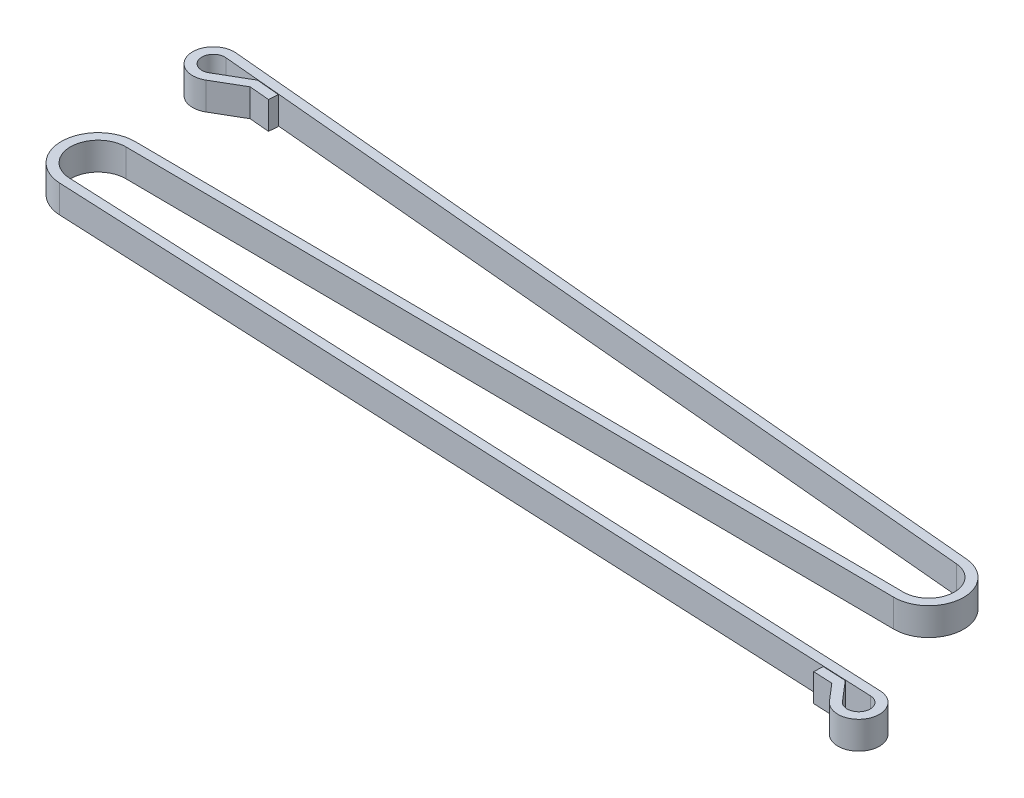
ISO-10303-21;
HEADER;
FILE_DESCRIPTION(('STEP AP214'),'2;1');
FILE_NAME('part.step','',(''),(''),'','','');
FILE_SCHEMA(('AUTOMOTIVE_DESIGN { 1 0 10303 214 1 1 1 1 }'));
ENDSEC;
DATA;
#1=APPLICATION_CONTEXT('core data for automotive mechanical design processes');
#2=APPLICATION_PROTOCOL_DEFINITION('international standard','automotive_design',2000,#1);
#3=PRODUCT_CONTEXT('',#1,'mechanical');
#4=PRODUCT('Part','Part','',(#3));
#5=PRODUCT_RELATED_PRODUCT_CATEGORY('part','',(#4));
#6=PRODUCT_DEFINITION_FORMATION('','',#4);
#7=PRODUCT_DEFINITION_CONTEXT('part definition',#1,'design');
#8=PRODUCT_DEFINITION('design','',#6,#7);
#9=PRODUCT_DEFINITION_SHAPE('','',#8);
#10=(LENGTH_UNIT() NAMED_UNIT(*) SI_UNIT(.MILLI.,.METRE.));
#11=(NAMED_UNIT(*) PLANE_ANGLE_UNIT() SI_UNIT($,.RADIAN.));
#12=(NAMED_UNIT(*) SI_UNIT($,.STERADIAN.) SOLID_ANGLE_UNIT());
#13=UNCERTAINTY_MEASURE_WITH_UNIT(LENGTH_MEASURE(1.E-05),#10,'distance_accuracy_value','');
#14=(GEOMETRIC_REPRESENTATION_CONTEXT(3) GLOBAL_UNCERTAINTY_ASSIGNED_CONTEXT((#13)) GLOBAL_UNIT_ASSIGNED_CONTEXT((#10,
#11,#12)) REPRESENTATION_CONTEXT('',''));
#15=CARTESIAN_POINT('',(0.,0.,0.));
#16=DIRECTION('',(0.,0.,1.));
#17=DIRECTION('',(1.,0.,0.));
#18=AXIS2_PLACEMENT_3D('',#15,#16,#17);
#19=CARTESIAN_POINT('',(-88.4029970114421,22.3267766952965,-24.7014694605002));
#20=DIRECTION('',(0.0905339533207894,0.,-0.99589336944078));
#21=DIRECTION('',(-0.99589336944078,0.,-0.0905339533207894));
#22=AXIS2_PLACEMENT_3D('',#19,#20,#21);
#23=PLANE('',#22);
#24=DIRECTION('',(0.99589336944078,0.,0.0905339533207894));
#25=VECTOR('',#24,1.);
#26=CARTESIAN_POINT('',(-88.4029970114421,16.3267766952965,-24.7014694605002));
#27=LINE('',#26,#25);
#28=CARTESIAN_POINT('',(-87.767727276281,16.3267766952965,-24.6437188194035));
#29=VERTEX_POINT('',#28);
#30=CARTESIAN_POINT('',(-83.4235301642382,16.3267766952965,-24.2487996938963));
#31=VERTEX_POINT('',#30);
#32=EDGE_CURVE('E228',#29,#31,#27,.T.);
#33=ORIENTED_EDGE('',*,*,#32,.T.);
#34=DIRECTION('',(0.,-1.,0.));
#35=VECTOR('',#34,1.);
#36=CARTESIAN_POINT('',(-83.4235301642382,22.3267766952965,-24.2487996938963));
#37=LINE('',#36,#35);
#38=CARTESIAN_POINT('',(-83.4235301642382,22.3267766952965,-24.2487996938963));
#39=VERTEX_POINT('',#38);
#40=EDGE_CURVE('E11',#39,#31,#37,.T.);
#41=ORIENTED_EDGE('',*,*,#40,.F.);
#42=DIRECTION('',(0.99589336944078,0.,0.0905339533207894));
#43=VECTOR('',#42,1.);
#44=CARTESIAN_POINT('',(-88.4029970114421,22.3267766952965,-24.7014694605002));
#45=LINE('',#44,#43);
#46=CARTESIAN_POINT('',(-87.767727276281,22.3267766952965,-24.6437188194035));
#47=VERTEX_POINT('',#46);
#48=EDGE_CURVE('E141',#47,#39,#45,.T.);
#49=ORIENTED_EDGE('',*,*,#48,.F.);
#50=DIRECTION('',(0.,-1.,0.));
#51=VECTOR('',#50,1.);
#52=CARTESIAN_POINT('',(-87.767727276281,22.3267766952965,-24.6437188194035));
#53=LINE('',#52,#51);
#54=EDGE_CURVE('E224',#47,#29,#53,.T.);
#55=ORIENTED_EDGE('',*,*,#54,.T.);
#56=EDGE_LOOP('',(#33,#41,#49,#55));
#57=FACE_BOUND('',#56,.T.);
#58=ADVANCED_FACE('F37',(#57),#23,.F.);
#59=CARTESIAN_POINT('',(-83.2424622575966,22.3267766952965,-26.2405864327778));
#60=DIRECTION('',(0.99589336944078,0.,0.0905339533207872));
#61=DIRECTION('',(0.0905339533207872,0.,-0.99589336944078));
#62=AXIS2_PLACEMENT_3D('',#59,#60,#61);
#63=PLANE('',#62);
#64=DIRECTION('',(-0.0905339533207872,0.,0.99589336944078));
#65=VECTOR('',#64,1.);
#66=CARTESIAN_POINT('',(-83.2424622575966,16.3267766952965,-26.2405864327778));
#67=LINE('',#66,#65);
#68=CARTESIAN_POINT('',(-83.2424622575966,16.3267766952965,-26.2405864327778));
#69=VERTEX_POINT('',#68);
#70=EDGE_CURVE('E231',#69,#31,#67,.T.);
#71=ORIENTED_EDGE('',*,*,#70,.F.);
#72=DIRECTION('',(0.,-1.,0.));
#73=VECTOR('',#72,1.);
#74=CARTESIAN_POINT('',(-83.2424622575966,22.3267766952965,-26.2405864327778));
#75=LINE('',#74,#73);
#76=CARTESIAN_POINT('',(-83.2424622575966,22.3267766952965,-26.2405864327778));
#77=VERTEX_POINT('',#76);
#78=EDGE_CURVE('E45',#77,#69,#75,.T.);
#79=ORIENTED_EDGE('',*,*,#78,.F.);
#80=DIRECTION('',(-0.0905339533207872,0.,0.99589336944078));
#81=VECTOR('',#80,1.);
#82=CARTESIAN_POINT('',(-83.2424622575966,22.3267766952965,-26.2405864327778));
#83=LINE('',#82,#81);
#84=EDGE_CURVE('E353',#77,#39,#83,.T.);
#85=ORIENTED_EDGE('',*,*,#84,.T.);
#86=ORIENTED_EDGE('',*,*,#40,.T.);
#87=EDGE_LOOP('',(#71,#79,#85,#86));
#88=FACE_BOUND('',#87,.T.);
#89=ADVANCED_FACE('F340',(#88),#63,.T.);
#90=CARTESIAN_POINT('',(-88.2219291048005,22.3267766952965,-26.6932561993818));
#91=DIRECTION('',(0.0905339533207894,0.,-0.99589336944078));
#92=DIRECTION('',(-0.99589336944078,0.,-0.0905339533207894));
#93=AXIS2_PLACEMENT_3D('',#90,#91,#92);
#94=PLANE('',#93);
#95=DIRECTION('',(0.99589336944078,0.,0.0905339533207894));
#96=VECTOR('',#95,1.);
#97=CARTESIAN_POINT('',(-88.2219291048005,16.3267766952965,-26.6932561993818));
#98=LINE('',#97,#96);
#99=CARTESIAN_POINT('',(-88.2219291048005,16.3267766952965,-26.6932561993818));
#100=VERTEX_POINT('',#99);
#101=EDGE_CURVE('E234',#100,#69,#98,.T.);
#102=ORIENTED_EDGE('',*,*,#101,.F.);
#103=DIRECTION('',(0.,-1.,0.));
#104=VECTOR('',#103,1.);
#105=CARTESIAN_POINT('',(-88.2219291048005,22.3267766952965,-26.6932561993818));
#106=LINE('',#105,#104);
#107=CARTESIAN_POINT('',(-88.2219291048005,22.3267766952965,-26.6932561993818));
#108=VERTEX_POINT('',#107);
#109=EDGE_CURVE('E330',#108,#100,#106,.T.);
#110=ORIENTED_EDGE('',*,*,#109,.F.);
#111=DIRECTION('',(0.99589336944078,0.,0.0905339533207894));
#112=VECTOR('',#111,1.);
#113=CARTESIAN_POINT('',(-88.2219291048005,22.3267766952965,-26.6932561993818));
#114=LINE('',#113,#112);
#115=EDGE_CURVE('E337',#108,#77,#114,.T.);
#116=ORIENTED_EDGE('',*,*,#115,.T.);
#117=ORIENTED_EDGE('',*,*,#78,.T.);
#118=EDGE_LOOP('',(#102,#110,#116,#117));
#119=FACE_BOUND('',#118,.T.);
#120=ADVANCED_FACE('F335',(#119),#94,.T.);
#121=CARTESIAN_POINT('',(-94.8481355476016,22.3267766952965,-22.8389900658078));
#122=DIRECTION('',(-0.50279794181319,0.,-0.864403973676903));
#123=DIRECTION('',(-0.864403973676903,0.,0.50279794181319));
#124=AXIS2_PLACEMENT_3D('',#121,#122,#123);
#125=PLANE('',#124);
#126=DIRECTION('',(0.864403973676903,0.,-0.50279794181319));
#127=VECTOR('',#126,1.);
#128=CARTESIAN_POINT('',(-94.8481355476016,16.3267766952965,-22.8389900658078));
#129=LINE('',#128,#127);
#130=CARTESIAN_POINT('',(-94.8481355476016,16.3267766952965,-22.8389900658078));
#131=VERTEX_POINT('',#130);
#132=EDGE_CURVE('E237',#131,#100,#129,.T.);
#133=ORIENTED_EDGE('',*,*,#132,.F.);
#134=DIRECTION('',(0.,-1.,0.));
#135=VECTOR('',#134,1.);
#136=CARTESIAN_POINT('',(-94.8481355476016,22.3267766952965,-22.8389900658078));
#137=LINE('',#136,#135);
#138=CARTESIAN_POINT('',(-94.8481355476016,22.3267766952965,-22.8389900658078));
#139=VERTEX_POINT('',#138);
#140=EDGE_CURVE('E328',#139,#131,#137,.T.);
#141=ORIENTED_EDGE('',*,*,#140,.F.);
#142=DIRECTION('',(0.864403973676903,0.,-0.50279794181319));
#143=VECTOR('',#142,1.);
#144=CARTESIAN_POINT('',(-94.8481355476016,22.3267766952965,-22.8389900658078));
#145=LINE('',#144,#143);
#146=EDGE_CURVE('E350',#139,#108,#145,.T.);
#147=ORIENTED_EDGE('',*,*,#146,.T.);
#148=ORIENTED_EDGE('',*,*,#109,.T.);
#149=EDGE_LOOP('',(#133,#141,#147,#148));
#150=FACE_BOUND('',#149,.T.);
#151=ADVANCED_FACE('F347',(#150),#125,.T.);
#152=CARTESIAN_POINT('',(-96.105130402128,22.3267766952965,-25.0000000000015));
#153=DIRECTION('',(0.,-1.,0.));
#154=DIRECTION('',(1.,0.,0.));
#155=AXIS2_PLACEMENT_3D('',#152,#153,#154);
#156=CYLINDRICAL_SURFACE('',#155,2.49999999999795);
#157=CARTESIAN_POINT('',(-96.105130402128,16.3267766952965,-25.0000000000015));
#158=DIRECTION('',(0.,1.,0.));
#159=DIRECTION('',(-1.,0.,0.));
#160=AXIS2_PLACEMENT_3D('',#157,#158,#159);
#161=CIRCLE('',#160,2.49999999999795);
#162=CARTESIAN_POINT('',(-95.8787955188262,16.3267766952965,-27.4897334236014));
#163=VERTEX_POINT('',#162);
#164=EDGE_CURVE('E240',#163,#131,#161,.T.);
#165=ORIENTED_EDGE('',*,*,#164,.F.);
#166=DIRECTION('',(0.,-1.,0.));
#167=VECTOR('',#166,1.);
#168=CARTESIAN_POINT('',(-95.8787955188262,22.3267766952965,-27.4897334236014));
#169=LINE('',#168,#167);
#170=CARTESIAN_POINT('',(-95.8787955188262,22.3267766952965,-27.4897334236014));
#171=VERTEX_POINT('',#170);
#172=EDGE_CURVE('E326',#171,#163,#169,.T.);
#173=ORIENTED_EDGE('',*,*,#172,.F.);
#174=CARTESIAN_POINT('',(-96.105130402128,22.3267766952965,-25.0000000000015));
#175=DIRECTION('',(0.,1.,0.));
#176=DIRECTION('',(-1.,0.,0.));
#177=AXIS2_PLACEMENT_3D('',#174,#175,#176);
#178=CIRCLE('',#177,2.49999999999795);
#179=EDGE_CURVE('E355',#171,#139,#178,.T.);
#180=ORIENTED_EDGE('',*,*,#179,.T.);
#181=ORIENTED_EDGE('',*,*,#140,.T.);
#182=EDGE_LOOP('',(#165,#173,#180,#181));
#183=FACE_BOUND('',#182,.T.);
#184=ADVANCED_FACE('F431',(#183),#156,.F.);
#185=CARTESIAN_POINT('',(78.5024634409296,22.3267766952966,-11.6372082003959));
#186=DIRECTION('',(-0.0905339533207897,0.,0.99589336944078));
#187=DIRECTION('',(0.99589336944078,0.,0.0905339533207897));
#188=AXIS2_PLACEMENT_3D('',#185,#186,#187);
#189=PLANE('',#188);
#190=DIRECTION('',(-0.99589336944078,0.,-0.0905339533207897));
#191=VECTOR('',#190,1.);
#192=CARTESIAN_POINT('',(78.5024634409296,16.3267766952966,-11.6372082003959));
#193=LINE('',#192,#191);
#194=CARTESIAN_POINT('',(78.5024634409296,16.3267766952966,-11.6372082003955));
#195=VERTEX_POINT('',#194);
#196=EDGE_CURVE('E243',#195,#163,#193,.T.);
#197=ORIENTED_EDGE('',*,*,#196,.F.);
#198=DIRECTION('',(0.,-1.,0.));
#199=VECTOR('',#198,1.);
#200=CARTESIAN_POINT('',(78.5024634409296,22.3267766952966,-11.6372082003955));
#201=LINE('',#200,#199);
#202=CARTESIAN_POINT('',(78.5024634409296,22.3267766952966,-11.6372082003955));
#203=VERTEX_POINT('',#202);
#204=EDGE_CURVE('E324',#203,#195,#201,.T.);
#205=ORIENTED_EDGE('',*,*,#204,.F.);
#206=DIRECTION('',(-0.99589336944078,0.,-0.0905339533207897));
#207=VECTOR('',#206,1.);
#208=CARTESIAN_POINT('',(78.5024634409296,22.3267766952966,-11.6372082003959));
#209=LINE('',#208,#207);
#210=EDGE_CURVE('E361',#203,#171,#209,.T.);
#211=ORIENTED_EDGE('',*,*,#210,.T.);
#212=ORIENTED_EDGE('',*,*,#172,.T.);
#213=EDGE_LOOP('',(#197,#205,#211,#212));
#214=FACE_BOUND('',#213,.T.);
#215=ADVANCED_FACE('F434',(#214),#189,.T.);
#216=CARTESIAN_POINT('',(77.9999999999997,22.3267766952966,-6.11000000000358));
#217=DIRECTION('',(0.,-1.,0.));
#218=DIRECTION('',(1.,0.,0.));
#219=AXIS2_PLACEMENT_3D('',#216,#217,#218);
#220=CYLINDRICAL_SURFACE('',#219,5.54999999999553);
#221=CARTESIAN_POINT('',(77.9999999999997,16.3267766952966,-6.11000000000358));
#222=DIRECTION('',(0.,1.,0.));
#223=DIRECTION('',(1.,0.,0.));
#224=AXIS2_PLACEMENT_3D('',#221,#222,#223);
#225=CIRCLE('',#224,5.54999999999553);
#226=CARTESIAN_POINT('',(77.956049841955,16.3267766952966,-0.560174022231533));
#227=VERTEX_POINT('',#226);
#228=EDGE_CURVE('E246',#227,#195,#225,.T.);
#229=ORIENTED_EDGE('',*,*,#228,.F.);
#230=DIRECTION('',(0.,-1.,0.));
#231=VECTOR('',#230,1.);
#232=CARTESIAN_POINT('',(77.956049841955,22.3267766952966,-0.560174022231529));
#233=LINE('',#232,#231);
#234=CARTESIAN_POINT('',(77.956049841955,22.3267766952966,-0.560174022231529));
#235=VERTEX_POINT('',#234);
#236=EDGE_CURVE('E322',#235,#227,#233,.T.);
#237=ORIENTED_EDGE('',*,*,#236,.F.);
#238=CARTESIAN_POINT('',(77.9999999999997,22.3267766952966,-6.11000000000358));
#239=DIRECTION('',(0.,1.,0.));
#240=DIRECTION('',(1.,0.,0.));
#241=AXIS2_PLACEMENT_3D('',#238,#239,#240);
#242=CIRCLE('',#241,5.54999999999553);
#243=EDGE_CURVE('E364',#235,#203,#242,.T.);
#244=ORIENTED_EDGE('',*,*,#243,.T.);
#245=ORIENTED_EDGE('',*,*,#204,.T.);
#246=EDGE_LOOP('',(#229,#237,#244,#245));
#247=FACE_BOUND('',#246,.T.);
#248=ADVANCED_FACE('F438',(#247),#220,.F.);
#249=CARTESIAN_POINT('',(77.956049841955,22.3267766952966,-0.560174022231529));
#250=DIRECTION('',(0.00791894739544018,0.,-0.999968644644495));
#251=DIRECTION('',(-0.999968644644495,0.,-0.00791894739544018));
#252=AXIS2_PLACEMENT_3D('',#249,#250,#251);
#253=PLANE('',#252);
#254=DIRECTION('',(0.999968644644495,0.,0.00791894739544018));
#255=VECTOR('',#254,1.);
#256=CARTESIAN_POINT('',(77.956049841955,16.3267766952966,-0.560174022231533));
#257=LINE('',#256,#255);
#258=CARTESIAN_POINT('',(-89.9366484208362,16.3267766952965,-1.8897491571541));
#259=VERTEX_POINT('',#258);
#260=EDGE_CURVE('E249',#259,#227,#257,.T.);
#261=ORIENTED_EDGE('',*,*,#260,.F.);
#262=DIRECTION('',(0.,-1.,0.));
#263=VECTOR('',#262,1.);
#264=CARTESIAN_POINT('',(-89.9366484208362,22.3267766952965,-1.88974915715409));
#265=LINE('',#264,#263);
#266=CARTESIAN_POINT('',(-89.9366484208362,22.3267766952965,-1.88974915715409));
#267=VERTEX_POINT('',#266);
#268=EDGE_CURVE('E320',#267,#259,#265,.T.);
#269=ORIENTED_EDGE('',*,*,#268,.F.);
#270=DIRECTION('',(0.999968644644495,0.,0.00791894739544018));
#271=VECTOR('',#270,1.);
#272=CARTESIAN_POINT('',(77.956049841955,22.3267766952966,-0.560174022231529));
#273=LINE('',#272,#271);
#274=EDGE_CURVE('E367',#267,#235,#273,.T.);
#275=ORIENTED_EDGE('',*,*,#274,.T.);
#276=ORIENTED_EDGE('',*,*,#236,.T.);
#277=EDGE_LOOP('',(#261,#269,#275,#276));
#278=FACE_BOUND('',#277,.T.);
#279=ADVANCED_FACE('F442',(#278),#253,.T.);
#280=CARTESIAN_POINT('',(-89.9999999999998,22.3267766952965,6.11000000000324));
#281=DIRECTION('',(0.,-1.,0.));
#282=DIRECTION('',(1.,0.,0.));
#283=AXIS2_PLACEMENT_3D('',#280,#281,#282);
#284=CYLINDRICAL_SURFACE('',#283,8.00000000000137);
#285=CARTESIAN_POINT('',(-89.9999999999998,16.3267766952965,6.11000000000323));
#286=DIRECTION('',(0.,-1.,0.));
#287=DIRECTION('',(-1.,0.,0.));
#288=AXIS2_PLACEMENT_3D('',#285,#286,#287);
#289=CIRCLE('',#288,8.00000000000137);
#290=CARTESIAN_POINT('',(-90.3641394185403,16.3267766952965,14.1017083582885));
#291=VERTEX_POINT('',#290);
#292=EDGE_CURVE('E252',#291,#259,#289,.T.);
#293=ORIENTED_EDGE('',*,*,#292,.F.);
#294=DIRECTION('',(0.,-1.,0.));
#295=VECTOR('',#294,1.);
#296=CARTESIAN_POINT('',(-90.3641394185403,22.3267766952965,14.1017083582885));
#297=LINE('',#296,#295);
#298=CARTESIAN_POINT('',(-90.3641394185403,22.3267766952965,14.1017083582885));
#299=VERTEX_POINT('',#298);
#300=EDGE_CURVE('E318',#299,#291,#297,.T.);
#301=ORIENTED_EDGE('',*,*,#300,.F.);
#302=CARTESIAN_POINT('',(-89.9999999999998,22.3267766952965,6.11000000000324));
#303=DIRECTION('',(0.,-1.,0.));
#304=DIRECTION('',(-1.,0.,0.));
#305=AXIS2_PLACEMENT_3D('',#302,#303,#304);
#306=CIRCLE('',#305,8.00000000000137);
#307=EDGE_CURVE('E370',#299,#267,#306,.T.);
#308=ORIENTED_EDGE('',*,*,#307,.T.);
#309=ORIENTED_EDGE('',*,*,#268,.T.);
#310=EDGE_LOOP('',(#293,#301,#308,#309));
#311=FACE_BOUND('',#310,.T.);
#312=ADVANCED_FACE('F446',(#311),#284,.T.);
#313=CARTESIAN_POINT('',(94.0086631661594,22.3267766952966,22.5025911380359));
#314=DIRECTION('',(-0.0455174273175596,0.,0.99896354478549));
#315=DIRECTION('',(0.99896354478549,0.,0.0455174273175596));
#316=AXIS2_PLACEMENT_3D('',#313,#314,#315);
#317=PLANE('',#316);
#318=DIRECTION('',(-0.99896354478549,0.,-0.0455174273175596));
#319=VECTOR('',#318,1.);
#320=CARTESIAN_POINT('',(94.0086631661594,16.3267766952966,22.5025911380359));
#321=LINE('',#320,#319);
#322=CARTESIAN_POINT('',(94.0086631661594,16.3267766952966,22.5025911380359));
#323=VERTEX_POINT('',#322);
#324=EDGE_CURVE('E255',#323,#291,#321,.T.);
#325=ORIENTED_EDGE('',*,*,#324,.F.);
#326=DIRECTION('',(0.,-1.,0.));
#327=VECTOR('',#326,1.);
#328=CARTESIAN_POINT('',(94.0086631661594,22.3267766952966,22.5025911380359));
#329=LINE('',#328,#327);
#330=CARTESIAN_POINT('',(94.0086631661594,22.3267766952966,22.5025911380359));
#331=VERTEX_POINT('',#330);
#332=EDGE_CURVE('E316',#331,#323,#329,.T.);
#333=ORIENTED_EDGE('',*,*,#332,.F.);
#334=DIRECTION('',(-0.99896354478549,0.,-0.0455174273175596));
#335=VECTOR('',#334,1.);
#336=CARTESIAN_POINT('',(94.0086631661594,22.3267766952966,22.5025911380359));
#337=LINE('',#336,#335);
#338=EDGE_CURVE('E373',#331,#299,#337,.T.);
#339=ORIENTED_EDGE('',*,*,#338,.T.);
#340=ORIENTED_EDGE('',*,*,#300,.T.);
#341=EDGE_LOOP('',(#325,#333,#339,#340));
#342=FACE_BOUND('',#341,.T.);
#343=ADVANCED_FACE('F450',(#342),#317,.T.);
#344=CARTESIAN_POINT('',(93.8948695978655,22.3267766952966,24.9999999999998));
#345=DIRECTION('',(0.,-1.,0.));
#346=DIRECTION('',(1.,0.,0.));
#347=AXIS2_PLACEMENT_3D('',#344,#345,#346);
#348=CYLINDRICAL_SURFACE('',#347,2.50000000000016);
#349=CARTESIAN_POINT('',(93.8948695978655,16.3267766952966,24.9999999999998));
#350=DIRECTION('',(0.,1.,0.));
#351=DIRECTION('',(1.,0.,0.));
#352=AXIS2_PLACEMENT_3D('',#349,#350,#351);
#353=CIRCLE('',#352,2.50000000000016);
#354=CARTESIAN_POINT('',(91.9972503243078,16.3267766952966,26.6275875069017));
#355=VERTEX_POINT('',#354);
#356=EDGE_CURVE('E258',#355,#323,#353,.T.);
#357=ORIENTED_EDGE('',*,*,#356,.F.);
#358=DIRECTION('',(0.,-1.,0.));
#359=VECTOR('',#358,1.);
#360=CARTESIAN_POINT('',(91.9972503243078,22.3267766952966,26.6275875069017));
#361=LINE('',#360,#359);
#362=CARTESIAN_POINT('',(91.9972503243078,22.3267766952966,26.6275875069017));
#363=VERTEX_POINT('',#362);
#364=EDGE_CURVE('E314',#363,#355,#361,.T.);
#365=ORIENTED_EDGE('',*,*,#364,.F.);
#366=CARTESIAN_POINT('',(93.8948695978655,22.3267766952966,24.9999999999998));
#367=DIRECTION('',(0.,1.,0.));
#368=DIRECTION('',(1.,0.,0.));
#369=AXIS2_PLACEMENT_3D('',#366,#367,#368);
#370=CIRCLE('',#369,2.50000000000016);
#371=EDGE_CURVE('E376',#363,#331,#370,.T.);
#372=ORIENTED_EDGE('',*,*,#371,.T.);
#373=ORIENTED_EDGE('',*,*,#332,.T.);
#374=EDGE_LOOP('',(#357,#365,#372,#373));
#375=FACE_BOUND('',#374,.T.);
#376=ADVANCED_FACE('F454',(#375),#348,.F.);
#377=CARTESIAN_POINT('',(91.9972503243078,22.3267766952966,26.6275875069017));
#378=DIRECTION('',(0.759047709423068,0.,-0.651035002760677));
#379=DIRECTION('',(-0.651035002760677,0.,-0.759047709423068));
#380=AXIS2_PLACEMENT_3D('',#377,#378,#379);
#381=PLANE('',#380);
#382=DIRECTION('',(0.651035002760677,0.,0.759047709423068));
#383=VECTOR('',#382,1.);
#384=CARTESIAN_POINT('',(91.9972503243078,16.3267766952966,26.6275875069017));
#385=LINE('',#384,#383);
#386=CARTESIAN_POINT('',(88.3228968428104,16.3267766952966,22.343624921304));
#387=VERTEX_POINT('',#386);
#388=EDGE_CURVE('E261',#387,#355,#385,.T.);
#389=ORIENTED_EDGE('',*,*,#388,.F.);
#390=DIRECTION('',(0.,-1.,0.));
#391=VECTOR('',#390,1.);
#392=CARTESIAN_POINT('',(88.3228968428104,22.3267766952966,22.343624921304));
#393=LINE('',#392,#391);
#394=CARTESIAN_POINT('',(88.3228968428104,22.3267766952966,22.343624921304));
#395=VERTEX_POINT('',#394);
#396=EDGE_CURVE('E312',#395,#387,#393,.T.);
#397=ORIENTED_EDGE('',*,*,#396,.F.);
#398=DIRECTION('',(0.651035002760677,0.,0.759047709423068));
#399=VECTOR('',#398,1.);
#400=CARTESIAN_POINT('',(91.9972503243078,22.3267766952966,26.6275875069017));
#401=LINE('',#400,#399);
#402=EDGE_CURVE('E379',#395,#363,#401,.T.);
#403=ORIENTED_EDGE('',*,*,#402,.T.);
#404=ORIENTED_EDGE('',*,*,#364,.T.);
#405=EDGE_LOOP('',(#389,#397,#403,#404));
#406=FACE_BOUND('',#405,.T.);
#407=ADVANCED_FACE('F458',(#406),#381,.T.);
#408=CARTESIAN_POINT('',(88.3228968428104,22.3267766952966,22.343624921304));
#409=DIRECTION('',(0.0455174273175589,0.,-0.99896354478549));
#410=DIRECTION('',(-0.99896354478549,0.,-0.0455174273175589));
#411=AXIS2_PLACEMENT_3D('',#408,#409,#410);
#412=PLANE('',#411);
#413=DIRECTION('',(0.99896354478549,0.,0.0455174273175589));
#414=VECTOR('',#413,1.);
#415=CARTESIAN_POINT('',(88.3228968428104,16.3267766952966,22.343624921304));
#416=LINE('',#415,#414);
#417=CARTESIAN_POINT('',(83.328079118883,16.3267766952966,22.1160377847162));
#418=VERTEX_POINT('',#417);
#419=EDGE_CURVE('E264',#418,#387,#416,.T.);
#420=ORIENTED_EDGE('',*,*,#419,.F.);
#421=DIRECTION('',(0.,-1.,0.));
#422=VECTOR('',#421,1.);
#423=CARTESIAN_POINT('',(83.328079118883,22.3267766952966,22.1160377847162));
#424=LINE('',#423,#422);
#425=CARTESIAN_POINT('',(83.328079118883,22.3267766952966,22.1160377847162));
#426=VERTEX_POINT('',#425);
#427=EDGE_CURVE('E310',#426,#418,#424,.T.);
#428=ORIENTED_EDGE('',*,*,#427,.F.);
#429=DIRECTION('',(0.99896354478549,0.,0.0455174273175589));
#430=VECTOR('',#429,1.);
#431=CARTESIAN_POINT('',(88.3228968428104,22.3267766952966,22.343624921304));
#432=LINE('',#431,#430);
#433=EDGE_CURVE('E382',#426,#395,#432,.T.);
#434=ORIENTED_EDGE('',*,*,#433,.T.);
#435=ORIENTED_EDGE('',*,*,#396,.T.);
#436=EDGE_LOOP('',(#420,#428,#434,#435));
#437=FACE_BOUND('',#436,.T.);
#438=ADVANCED_FACE('F462',(#437),#412,.T.);
#439=CARTESIAN_POINT('',(83.2370442642479,22.3267766952966,24.1139648742872));
#440=DIRECTION('',(-0.99896354478549,0.,-0.0455174273175582));
#441=DIRECTION('',(-0.0455174273175582,0.,0.99896354478549));
#442=AXIS2_PLACEMENT_3D('',#439,#440,#441);
#443=PLANE('',#442);
#444=DIRECTION('',(0.0455174273175582,0.,-0.99896354478549));
#445=VECTOR('',#444,1.);
#446=CARTESIAN_POINT('',(83.2370442642479,16.3267766952966,24.1139648742872));
#447=LINE('',#446,#445);
#448=CARTESIAN_POINT('',(83.2370442642479,16.3267766952966,24.1139648742872));
#449=VERTEX_POINT('',#448);
#450=EDGE_CURVE('E267',#449,#418,#447,.T.);
#451=ORIENTED_EDGE('',*,*,#450,.F.);
#452=DIRECTION('',(0.,-1.,0.));
#453=VECTOR('',#452,1.);
#454=CARTESIAN_POINT('',(83.2370442642479,22.3267766952966,24.1139648742872));
#455=LINE('',#454,#453);
#456=CARTESIAN_POINT('',(83.2370442642479,22.3267766952966,24.1139648742872));
#457=VERTEX_POINT('',#456);
#458=EDGE_CURVE('E308',#457,#449,#455,.T.);
#459=ORIENTED_EDGE('',*,*,#458,.F.);
#460=DIRECTION('',(0.0455174273175582,0.,-0.99896354478549));
#461=VECTOR('',#460,1.);
#462=CARTESIAN_POINT('',(83.2370442642479,22.3267766952966,24.1139648742872));
#463=LINE('',#462,#461);
#464=EDGE_CURVE('E385',#457,#426,#463,.T.);
#465=ORIENTED_EDGE('',*,*,#464,.T.);
#466=ORIENTED_EDGE('',*,*,#427,.T.);
#467=EDGE_LOOP('',(#451,#459,#465,#466));
#468=FACE_BOUND('',#467,.T.);
#469=ADVANCED_FACE('F466',(#468),#443,.T.);
#470=CARTESIAN_POINT('',(88.2318619881753,22.3267766952966,24.3415520108749));
#471=DIRECTION('',(0.0455174273175589,0.,-0.99896354478549));
#472=DIRECTION('',(-0.99896354478549,0.,-0.0455174273175589));
#473=AXIS2_PLACEMENT_3D('',#470,#471,#472);
#474=PLANE('',#473);
#475=DIRECTION('',(0.99896354478549,0.,0.0455174273175589));
#476=VECTOR('',#475,1.);
#477=CARTESIAN_POINT('',(88.2318619881753,16.3267766952966,24.3415520108749));
#478=LINE('',#477,#476);
#479=CARTESIAN_POINT('',(87.3678724519615,16.3267766952966,24.3021846274273));
#480=VERTEX_POINT('',#479);
#481=EDGE_CURVE('E270',#449,#480,#478,.T.);
#482=ORIENTED_EDGE('',*,*,#481,.T.);
#483=DIRECTION('',(0.,-1.,0.));
#484=VECTOR('',#483,1.);
#485=CARTESIAN_POINT('',(87.3678724519615,22.3267766952966,24.3021846274274));
#486=LINE('',#485,#484);
#487=CARTESIAN_POINT('',(87.3678724519615,22.3267766952966,24.3021846274274));
#488=VERTEX_POINT('',#487);
#489=EDGE_CURVE('E305',#488,#480,#486,.T.);
#490=ORIENTED_EDGE('',*,*,#489,.F.);
#491=DIRECTION('',(0.99896354478549,0.,0.0455174273175589));
#492=VECTOR('',#491,1.);
#493=CARTESIAN_POINT('',(88.2318619881753,22.3267766952966,24.3415520108749));
#494=LINE('',#493,#492);
#495=EDGE_CURVE('E388',#457,#488,#494,.T.);
#496=ORIENTED_EDGE('',*,*,#495,.F.);
#497=ORIENTED_EDGE('',*,*,#458,.T.);
#498=EDGE_LOOP('',(#482,#490,#496,#497));
#499=FACE_BOUND('',#498,.T.);
#500=ADVANCED_FACE('F470',(#499),#474,.F.);
#501=CARTESIAN_POINT('',(90.4791549054616,22.3267766952966,27.929657512423));
#502=DIRECTION('',(0.759047709423068,0.,-0.651035002760677));
#503=DIRECTION('',(-0.651035002760677,0.,-0.759047709423068));
#504=AXIS2_PLACEMENT_3D('',#501,#502,#503);
#505=PLANE('',#504);
#506=DIRECTION('',(0.651035002760677,0.,0.759047709423068));
#507=VECTOR('',#506,1.);
#508=CARTESIAN_POINT('',(90.4791549054616,16.3267766952966,27.929657512423));
#509=LINE('',#508,#507);
#510=CARTESIAN_POINT('',(90.4791549054617,16.3267766952966,27.9296575124231));
#511=VERTEX_POINT('',#510);
#512=EDGE_CURVE('E272',#480,#511,#509,.T.);
#513=ORIENTED_EDGE('',*,*,#512,.T.);
#514=DIRECTION('',(0.,-1.,0.));
#515=VECTOR('',#514,1.);
#516=CARTESIAN_POINT('',(90.4791549054617,22.3267766952966,27.9296575124231));
#517=LINE('',#516,#515);
#518=CARTESIAN_POINT('',(90.4791549054617,22.3267766952966,27.9296575124231));
#519=VERTEX_POINT('',#518);
#520=EDGE_CURVE('E302',#519,#511,#517,.T.);
#521=ORIENTED_EDGE('',*,*,#520,.F.);
#522=DIRECTION('',(0.651035002760677,0.,0.759047709423068));
#523=VECTOR('',#522,1.);
#524=CARTESIAN_POINT('',(90.4791549054616,22.3267766952966,27.929657512423));
#525=LINE('',#524,#523);
#526=EDGE_CURVE('E390',#488,#519,#525,.T.);
#527=ORIENTED_EDGE('',*,*,#526,.F.);
#528=ORIENTED_EDGE('',*,*,#489,.T.);
#529=EDGE_LOOP('',(#513,#521,#527,#528));
#530=FACE_BOUND('',#529,.T.);
#531=ADVANCED_FACE('F474',(#530),#505,.F.);
#532=CARTESIAN_POINT('',(93.8948695978655,22.3267766952966,24.9999999999998));
#533=DIRECTION('',(0.,-1.,0.));
#534=DIRECTION('',(1.,0.,0.));
#535=AXIS2_PLACEMENT_3D('',#532,#533,#534);
#536=CYLINDRICAL_SURFACE('',#535,4.50000000000016);
#537=CARTESIAN_POINT('',(93.8948695978655,16.3267766952966,24.9999999999998));
#538=DIRECTION('',(0.,1.,0.));
#539=DIRECTION('',(1.,0.,0.));
#540=AXIS2_PLACEMENT_3D('',#537,#538,#539);
#541=CIRCLE('',#540,4.50000000000016);
#542=CARTESIAN_POINT('',(94.0996980207945,16.3267766952966,20.5046640484649));
#543=VERTEX_POINT('',#542);
#544=EDGE_CURVE('E274',#511,#543,#541,.T.);
#545=ORIENTED_EDGE('',*,*,#544,.T.);
#546=DIRECTION('',(0.,-1.,0.));
#547=VECTOR('',#546,1.);
#548=CARTESIAN_POINT('',(94.0996980207945,22.3267766952966,20.5046640484649));
#549=LINE('',#548,#547);
#550=CARTESIAN_POINT('',(94.0996980207945,22.3267766952966,20.5046640484649));
#551=VERTEX_POINT('',#550);
#552=EDGE_CURVE('E299',#551,#543,#549,.T.);
#553=ORIENTED_EDGE('',*,*,#552,.F.);
#554=CARTESIAN_POINT('',(93.8948695978655,22.3267766952966,24.9999999999998));
#555=DIRECTION('',(0.,1.,0.));
#556=DIRECTION('',(1.,0.,0.));
#557=AXIS2_PLACEMENT_3D('',#554,#555,#556);
#558=CIRCLE('',#557,4.50000000000016);
#559=EDGE_CURVE('E392',#519,#551,#558,.T.);
#560=ORIENTED_EDGE('',*,*,#559,.F.);
#561=ORIENTED_EDGE('',*,*,#520,.T.);
#562=EDGE_LOOP('',(#545,#553,#560,#561));
#563=FACE_BOUND('',#562,.T.);
#564=ADVANCED_FACE('F478',(#563),#536,.T.);
#565=CARTESIAN_POINT('',(94.0996980207945,22.3267766952966,20.5046640484649));
#566=DIRECTION('',(-0.0455174273175596,0.,0.99896354478549));
#567=DIRECTION('',(0.99896354478549,0.,0.0455174273175596));
#568=AXIS2_PLACEMENT_3D('',#565,#566,#567);
#569=PLANE('',#568);
#570=DIRECTION('',(-0.99896354478549,0.,-0.0455174273175596));
#571=VECTOR('',#570,1.);
#572=CARTESIAN_POINT('',(94.0996980207945,16.3267766952966,20.5046640484649));
#573=LINE('',#572,#571);
#574=CARTESIAN_POINT('',(-90.2731045639052,16.3267766952965,12.1037812687175));
#575=VERTEX_POINT('',#574);
#576=EDGE_CURVE('E276',#543,#575,#573,.T.);
#577=ORIENTED_EDGE('',*,*,#576,.T.);
#578=DIRECTION('',(0.,-1.,0.));
#579=VECTOR('',#578,1.);
#580=CARTESIAN_POINT('',(-90.2731045639052,22.3267766952965,12.1037812687175));
#581=LINE('',#580,#579);
#582=CARTESIAN_POINT('',(-90.2731045639052,22.3267766952965,12.1037812687175));
#583=VERTEX_POINT('',#582);
#584=EDGE_CURVE('E296',#583,#575,#581,.T.);
#585=ORIENTED_EDGE('',*,*,#584,.F.);
#586=DIRECTION('',(-0.99896354478549,0.,-0.0455174273175596));
#587=VECTOR('',#586,1.);
#588=CARTESIAN_POINT('',(94.0996980207945,22.3267766952966,20.5046640484649));
#589=LINE('',#588,#587);
#590=EDGE_CURVE('E394',#551,#583,#589,.T.);
#591=ORIENTED_EDGE('',*,*,#590,.F.);
#592=ORIENTED_EDGE('',*,*,#552,.T.);
#593=EDGE_LOOP('',(#577,#585,#591,#592));
#594=FACE_BOUND('',#593,.T.);
#595=ADVANCED_FACE('F482',(#594),#569,.F.);
#596=CARTESIAN_POINT('',(-89.9999999999998,22.3267766952965,6.11000000000324));
#597=DIRECTION('',(0.,-1.,0.));
#598=DIRECTION('',(1.,0.,0.));
#599=AXIS2_PLACEMENT_3D('',#596,#597,#598);
#600=CYLINDRICAL_SURFACE('',#599,6.00000000000137);
#601=CARTESIAN_POINT('',(-89.9999999999998,16.3267766952965,6.11000000000323));
#602=DIRECTION('',(0.,1.,0.));
#603=DIRECTION('',(1.,0.,0.));
#604=AXIS2_PLACEMENT_3D('',#601,#602,#603);
#605=CIRCLE('',#604,6.00000000000137);
#606=CARTESIAN_POINT('',(-89.9524863156272,16.3267766952965,0.110188132134877));
#607=VERTEX_POINT('',#606);
#608=EDGE_CURVE('E278',#575,#607,#605,.F.);
#609=ORIENTED_EDGE('',*,*,#608,.T.);
#610=DIRECTION('',(0.,-1.,0.));
#611=VECTOR('',#610,1.);
#612=CARTESIAN_POINT('',(-89.9524863156272,22.3267766952965,0.11018813213488));
#613=LINE('',#612,#611);
#614=CARTESIAN_POINT('',(-89.9524863156272,22.3267766952965,0.11018813213488));
#615=VERTEX_POINT('',#614);
#616=EDGE_CURVE('E293',#615,#607,#613,.T.);
#617=ORIENTED_EDGE('',*,*,#616,.F.);
#618=CARTESIAN_POINT('',(-89.9999999999998,22.3267766952965,6.11000000000324));
#619=DIRECTION('',(0.,1.,0.));
#620=DIRECTION('',(1.,0.,0.));
#621=AXIS2_PLACEMENT_3D('',#618,#619,#620);
#622=CIRCLE('',#621,6.00000000000137);
#623=EDGE_CURVE('E396',#583,#615,#622,.F.);
#624=ORIENTED_EDGE('',*,*,#623,.F.);
#625=ORIENTED_EDGE('',*,*,#584,.T.);
#626=EDGE_LOOP('',(#609,#617,#624,#625));
#627=FACE_BOUND('',#626,.T.);
#628=ADVANCED_FACE('F486',(#627),#600,.F.);
#629=CARTESIAN_POINT('',(77.9402119471641,22.3267766952966,1.43976326705746));
#630=DIRECTION('',(0.00791894739544018,0.,-0.999968644644495));
#631=DIRECTION('',(-0.999968644644495,0.,-0.00791894739544018));
#632=AXIS2_PLACEMENT_3D('',#629,#630,#631);
#633=PLANE('',#632);
#634=DIRECTION('',(0.999968644644495,0.,0.00791894739544018));
#635=VECTOR('',#634,1.);
#636=CARTESIAN_POINT('',(77.9402119471641,16.3267766952966,1.43976326705746));
#637=LINE('',#636,#635);
#638=CARTESIAN_POINT('',(77.9402119471641,16.3267766952966,1.43976326705789));
#639=VERTEX_POINT('',#638);
#640=EDGE_CURVE('E280',#607,#639,#637,.T.);
#641=ORIENTED_EDGE('',*,*,#640,.T.);
#642=DIRECTION('',(0.,-1.,0.));
#643=VECTOR('',#642,1.);
#644=CARTESIAN_POINT('',(77.9402119471641,22.3267766952966,1.43976326705789));
#645=LINE('',#644,#643);
#646=CARTESIAN_POINT('',(77.9402119471641,22.3267766952966,1.43976326705789));
#647=VERTEX_POINT('',#646);
#648=EDGE_CURVE('E290',#647,#639,#645,.T.);
#649=ORIENTED_EDGE('',*,*,#648,.F.);
#650=DIRECTION('',(0.999968644644495,0.,0.00791894739544018));
#651=VECTOR('',#650,1.);
#652=CARTESIAN_POINT('',(77.9402119471641,22.3267766952966,1.43976326705746));
#653=LINE('',#652,#651);
#654=EDGE_CURVE('E398',#615,#647,#653,.T.);
#655=ORIENTED_EDGE('',*,*,#654,.F.);
#656=ORIENTED_EDGE('',*,*,#616,.T.);
#657=EDGE_LOOP('',(#641,#649,#655,#656));
#658=FACE_BOUND('',#657,.T.);
#659=ADVANCED_FACE('F404',(#658),#633,.F.);
#660=CARTESIAN_POINT('',(77.9999999999997,22.3267766952966,-6.11000000000358));
#661=DIRECTION('',(0.,-1.,0.));
#662=DIRECTION('',(1.,0.,0.));
#663=AXIS2_PLACEMENT_3D('',#660,#661,#662);
#664=CYLINDRICAL_SURFACE('',#663,7.54999999999553);
#665=CARTESIAN_POINT('',(77.9999999999997,16.3267766952966,-6.11000000000358));
#666=DIRECTION('',(0.,1.,0.));
#667=DIRECTION('',(1.,0.,0.));
#668=AXIS2_PLACEMENT_3D('',#665,#666,#667);
#669=CIRCLE('',#668,7.54999999999553);
#670=CARTESIAN_POINT('',(78.6835313475712,16.3267766952966,-13.6289949392775));
#671=VERTEX_POINT('',#670);
#672=EDGE_CURVE('E282',#639,#671,#669,.T.);
#673=ORIENTED_EDGE('',*,*,#672,.T.);
#674=DIRECTION('',(0.,-1.,0.));
#675=VECTOR('',#674,1.);
#676=CARTESIAN_POINT('',(78.6835313475712,22.3267766952966,-13.6289949392774));
#677=LINE('',#676,#675);
#678=CARTESIAN_POINT('',(78.6835313475712,22.3267766952966,-13.6289949392774));
#679=VERTEX_POINT('',#678);
#680=EDGE_CURVE('E219',#679,#671,#677,.T.);
#681=ORIENTED_EDGE('',*,*,#680,.F.);
#682=CARTESIAN_POINT('',(77.9999999999997,22.3267766952966,-6.11000000000358));
#683=DIRECTION('',(0.,1.,0.));
#684=DIRECTION('',(1.,0.,0.));
#685=AXIS2_PLACEMENT_3D('',#682,#683,#684);
#686=CIRCLE('',#685,7.54999999999553);
#687=EDGE_CURVE('E210',#647,#679,#686,.T.);
#688=ORIENTED_EDGE('',*,*,#687,.F.);
#689=ORIENTED_EDGE('',*,*,#648,.T.);
#690=EDGE_LOOP('',(#673,#681,#688,#689));
#691=FACE_BOUND('',#690,.T.);
#692=ADVANCED_FACE('F408',(#691),#664,.T.);
#693=CARTESIAN_POINT('',(78.6835313475712,22.3267766952966,-13.6289949392774));
#694=DIRECTION('',(-0.0905339533207897,0.,0.99589336944078));
#695=DIRECTION('',(0.99589336944078,0.,0.0905339533207897));
#696=AXIS2_PLACEMENT_3D('',#693,#694,#695);
#697=PLANE('',#696);
#698=DIRECTION('',(-0.99589336944078,0.,-0.0905339533207897));
#699=VECTOR('',#698,1.);
#700=CARTESIAN_POINT('',(78.6835313475712,16.3267766952966,-13.6289949392775));
#701=LINE('',#700,#699);
#702=CARTESIAN_POINT('',(-95.6977276121846,16.3267766952965,-29.481520162483));
#703=VERTEX_POINT('',#702);
#704=EDGE_CURVE('E218',#671,#703,#701,.T.);
#705=ORIENTED_EDGE('',*,*,#704,.T.);
#706=DIRECTION('',(0.,-1.,0.));
#707=VECTOR('',#706,1.);
#708=CARTESIAN_POINT('',(-95.6977276121846,22.3267766952965,-29.481520162483));
#709=LINE('',#708,#707);
#710=CARTESIAN_POINT('',(-95.6977276121846,22.3267766952965,-29.481520162483));
#711=VERTEX_POINT('',#710);
#712=EDGE_CURVE('E215',#711,#703,#709,.T.);
#713=ORIENTED_EDGE('',*,*,#712,.F.);
#714=DIRECTION('',(-0.99589336944078,0.,-0.0905339533207897));
#715=VECTOR('',#714,1.);
#716=CARTESIAN_POINT('',(78.6835313475712,22.3267766952966,-13.6289949392774));
#717=LINE('',#716,#715);
#718=EDGE_CURVE('E204',#679,#711,#717,.T.);
#719=ORIENTED_EDGE('',*,*,#718,.F.);
#720=ORIENTED_EDGE('',*,*,#680,.T.);
#721=EDGE_LOOP('',(#705,#713,#719,#720));
#722=FACE_BOUND('',#721,.T.);
#723=ADVANCED_FACE('F216',(#722),#697,.F.);
#724=CARTESIAN_POINT('',(-96.105130402128,22.3267766952965,-25.0000000000015));
#725=DIRECTION('',(0.,-1.,0.));
#726=DIRECTION('',(1.,0.,0.));
#727=AXIS2_PLACEMENT_3D('',#724,#725,#726);
#728=CYLINDRICAL_SURFACE('',#727,4.49999999999795);
#729=CARTESIAN_POINT('',(-96.105130402128,16.3267766952965,-25.0000000000015));
#730=DIRECTION('',(0.,1.,0.));
#731=DIRECTION('',(1.,0.,0.));
#732=AXIS2_PLACEMENT_3D('',#729,#730,#731);
#733=CIRCLE('',#732,4.49999999999795);
#734=CARTESIAN_POINT('',(-93.8425396639752,16.3267766952965,-21.110182118454));
#735=VERTEX_POINT('',#734);
#736=EDGE_CURVE('E129',#703,#735,#733,.T.);
#737=ORIENTED_EDGE('',*,*,#736,.T.);
#738=DIRECTION('',(0.,-1.,0.));
#739=VECTOR('',#738,1.);
#740=CARTESIAN_POINT('',(-93.8425396639752,22.3267766952965,-21.110182118454));
#741=LINE('',#740,#739);
#742=CARTESIAN_POINT('',(-93.8425396639752,22.3267766952965,-21.110182118454));
#743=VERTEX_POINT('',#742);
#744=EDGE_CURVE('E220',#743,#735,#741,.T.);
#745=ORIENTED_EDGE('',*,*,#744,.F.);
#746=CARTESIAN_POINT('',(-96.105130402128,22.3267766952965,-25.0000000000015));
#747=DIRECTION('',(0.,1.,0.));
#748=DIRECTION('',(1.,0.,0.));
#749=AXIS2_PLACEMENT_3D('',#746,#747,#748);
#750=CIRCLE('',#749,4.49999999999795);
#751=EDGE_CURVE('E208',#711,#743,#750,.T.);
#752=ORIENTED_EDGE('',*,*,#751,.F.);
#753=ORIENTED_EDGE('',*,*,#712,.T.);
#754=EDGE_LOOP('',(#737,#745,#752,#753));
#755=FACE_BOUND('',#754,.T.);
#756=ADVANCED_FACE('F222',(#755),#728,.T.);
#757=CARTESIAN_POINT('',(-93.8425396639752,22.3267766952965,-21.110182118454));
#758=DIRECTION('',(-0.50279794181319,0.,-0.864403973676903));
#759=DIRECTION('',(-0.864403973676903,0.,0.50279794181319));
#760=AXIS2_PLACEMENT_3D('',#757,#758,#759);
#761=PLANE('',#760);
#762=DIRECTION('',(0.864403973676903,0.,-0.50279794181319));
#763=VECTOR('',#762,1.);
#764=CARTESIAN_POINT('',(-93.8425396639752,16.3267766952965,-21.110182118454));
#765=LINE('',#764,#763);
#766=EDGE_CURVE('E135',#735,#29,#765,.T.);
#767=ORIENTED_EDGE('',*,*,#766,.T.);
#768=ORIENTED_EDGE('',*,*,#54,.F.);
#769=DIRECTION('',(0.864403973676903,0.,-0.50279794181319));
#770=VECTOR('',#769,1.);
#771=CARTESIAN_POINT('',(-93.8425396639752,22.3267766952965,-21.110182118454));
#772=LINE('',#771,#770);
#773=EDGE_CURVE('E53',#743,#47,#772,.T.);
#774=ORIENTED_EDGE('',*,*,#773,.F.);
#775=ORIENTED_EDGE('',*,*,#744,.T.);
#776=EDGE_LOOP('',(#767,#768,#774,#775));
#777=FACE_BOUND('',#776,.T.);
#778=ADVANCED_FACE('F410',(#777),#761,.F.);
#779=CARTESIAN_POINT('',(-96.105130402128,22.3267766952965,-25.0000000000015));
#780=DIRECTION('',(0.,1.,0.));
#781=DIRECTION('',(1.,0.,0.));
#782=AXIS2_PLACEMENT_3D('',#779,#780,#781);
#783=PLANE('',#782);
#784=ORIENTED_EDGE('',*,*,#48,.T.);
#785=ORIENTED_EDGE('',*,*,#84,.F.);
#786=ORIENTED_EDGE('',*,*,#115,.F.);
#787=ORIENTED_EDGE('',*,*,#146,.F.);
#788=ORIENTED_EDGE('',*,*,#179,.F.);
#789=ORIENTED_EDGE('',*,*,#210,.F.);
#790=ORIENTED_EDGE('',*,*,#243,.F.);
#791=ORIENTED_EDGE('',*,*,#274,.F.);
#792=ORIENTED_EDGE('',*,*,#307,.F.);
#793=ORIENTED_EDGE('',*,*,#338,.F.);
#794=ORIENTED_EDGE('',*,*,#371,.F.);
#795=ORIENTED_EDGE('',*,*,#402,.F.);
#796=ORIENTED_EDGE('',*,*,#433,.F.);
#797=ORIENTED_EDGE('',*,*,#464,.F.);
#798=ORIENTED_EDGE('',*,*,#495,.T.);
#799=ORIENTED_EDGE('',*,*,#526,.T.);
#800=ORIENTED_EDGE('',*,*,#559,.T.);
#801=ORIENTED_EDGE('',*,*,#590,.T.);
#802=ORIENTED_EDGE('',*,*,#623,.T.);
#803=ORIENTED_EDGE('',*,*,#654,.T.);
#804=ORIENTED_EDGE('',*,*,#687,.T.);
#805=ORIENTED_EDGE('',*,*,#718,.T.);
#806=ORIENTED_EDGE('',*,*,#751,.T.);
#807=ORIENTED_EDGE('',*,*,#773,.T.);
#808=EDGE_LOOP('',(#784,#785,#786,#787,#788,#789,#790,#791,#792,#793,#794,#795,#796,#797,#798,
#799,#800,#801,#802,#803,#804,#805,#806,#807));
#809=FACE_BOUND('',#808,.T.);
#810=ADVANCED_FACE('F206',(#809),#783,.T.);
#811=CARTESIAN_POINT('',(-96.105130402128,16.3267766952965,-25.0000000000015));
#812=DIRECTION('',(0.,1.,0.));
#813=DIRECTION('',(1.,0.,0.));
#814=AXIS2_PLACEMENT_3D('',#811,#812,#813);
#815=PLANE('',#814);
#816=ORIENTED_EDGE('',*,*,#32,.F.);
#817=ORIENTED_EDGE('',*,*,#766,.F.);
#818=ORIENTED_EDGE('',*,*,#736,.F.);
#819=ORIENTED_EDGE('',*,*,#704,.F.);
#820=ORIENTED_EDGE('',*,*,#672,.F.);
#821=ORIENTED_EDGE('',*,*,#640,.F.);
#822=ORIENTED_EDGE('',*,*,#608,.F.);
#823=ORIENTED_EDGE('',*,*,#576,.F.);
#824=ORIENTED_EDGE('',*,*,#544,.F.);
#825=ORIENTED_EDGE('',*,*,#512,.F.);
#826=ORIENTED_EDGE('',*,*,#481,.F.);
#827=ORIENTED_EDGE('',*,*,#450,.T.);
#828=ORIENTED_EDGE('',*,*,#419,.T.);
#829=ORIENTED_EDGE('',*,*,#388,.T.);
#830=ORIENTED_EDGE('',*,*,#356,.T.);
#831=ORIENTED_EDGE('',*,*,#324,.T.);
#832=ORIENTED_EDGE('',*,*,#292,.T.);
#833=ORIENTED_EDGE('',*,*,#260,.T.);
#834=ORIENTED_EDGE('',*,*,#228,.T.);
#835=ORIENTED_EDGE('',*,*,#196,.T.);
#836=ORIENTED_EDGE('',*,*,#164,.T.);
#837=ORIENTED_EDGE('',*,*,#132,.T.);
#838=ORIENTED_EDGE('',*,*,#101,.T.);
#839=ORIENTED_EDGE('',*,*,#70,.T.);
#840=EDGE_LOOP('',(#816,#817,#818,#819,#820,#821,#822,#823,#824,#825,#826,#827,#828,#829,#830,
#831,#832,#833,#834,#835,#836,#837,#838,#839));
#841=FACE_BOUND('',#840,.T.);
#842=ADVANCED_FACE('F343',(#841),#815,.F.);
#843=CLOSED_SHELL('',(#58,#89,#120,#151,#184,#215,#248,#279,#312,#343,#376,#407,#438,#469,#500,
#531,#564,#595,#628,#659,#692,#723,#756,#778,#810,#842));
#844=MANIFOLD_SOLID_BREP('B2',#843);
#845=ADVANCED_BREP_SHAPE_REPRESENTATION('',(#18,#844),#14);
#846=SHAPE_DEFINITION_REPRESENTATION(#9,#845);
ENDSEC;
END-ISO-10303-21;
